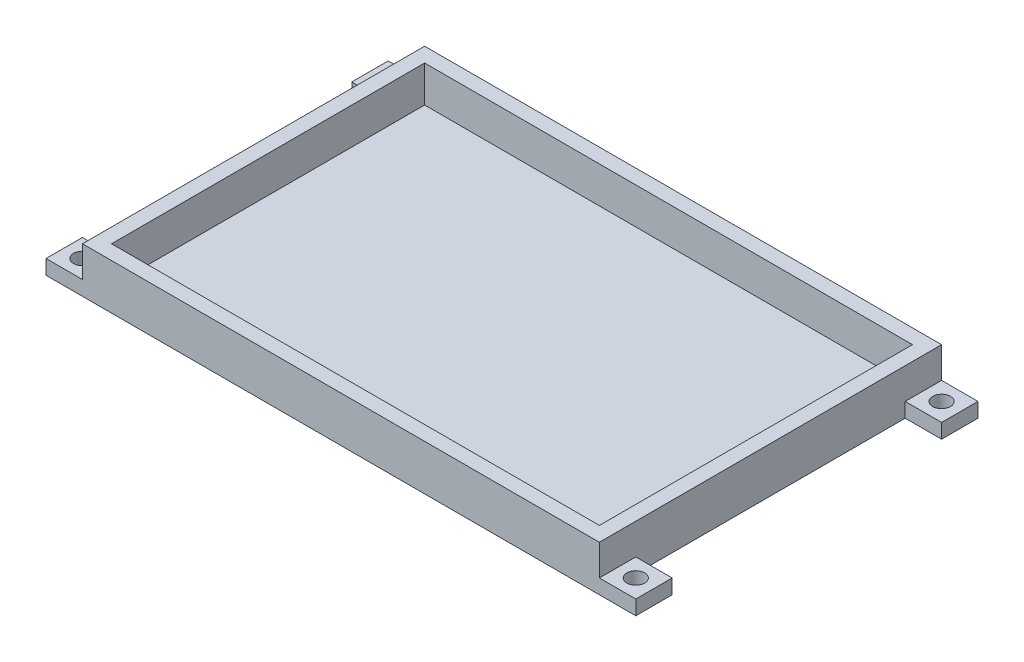
ISO-10303-21;
HEADER;
FILE_DESCRIPTION(('STEP AP214'),'2;1');
FILE_NAME('part.step','',(''),(''),'','','');
FILE_SCHEMA(('AUTOMOTIVE_DESIGN { 1 0 10303 214 1 1 1 1 }'));
ENDSEC;
DATA;
#1=APPLICATION_CONTEXT('core data for automotive mechanical design processes');
#2=APPLICATION_PROTOCOL_DEFINITION('international standard','automotive_design',2000,#1);
#3=PRODUCT_CONTEXT('',#1,'mechanical');
#4=PRODUCT('Part','Part','',(#3));
#5=PRODUCT_RELATED_PRODUCT_CATEGORY('part','',(#4));
#6=PRODUCT_DEFINITION_FORMATION('','',#4);
#7=PRODUCT_DEFINITION_CONTEXT('part definition',#1,'design');
#8=PRODUCT_DEFINITION('design','',#6,#7);
#9=PRODUCT_DEFINITION_SHAPE('','',#8);
#10=(LENGTH_UNIT() NAMED_UNIT(*) SI_UNIT(.MILLI.,.METRE.));
#11=(NAMED_UNIT(*) PLANE_ANGLE_UNIT() SI_UNIT($,.RADIAN.));
#12=(NAMED_UNIT(*) SI_UNIT($,.STERADIAN.) SOLID_ANGLE_UNIT());
#13=UNCERTAINTY_MEASURE_WITH_UNIT(LENGTH_MEASURE(1.E-05),#10,'distance_accuracy_value','');
#14=(GEOMETRIC_REPRESENTATION_CONTEXT(3) GLOBAL_UNCERTAINTY_ASSIGNED_CONTEXT((#13)) GLOBAL_UNIT_ASSIGNED_CONTEXT((#10,
#11,#12)) REPRESENTATION_CONTEXT('',''));
#15=CARTESIAN_POINT('',(0.,0.,0.));
#16=DIRECTION('',(0.,0.,1.));
#17=DIRECTION('',(1.,0.,0.));
#18=AXIS2_PLACEMENT_3D('',#15,#16,#17);
#19=CARTESIAN_POINT('',(87.63,6.35,-57.15));
#20=DIRECTION('',(-1.,0.,0.));
#21=DIRECTION('',(0.,0.,1.));
#22=AXIS2_PLACEMENT_3D('',#19,#20,#21);
#23=PLANE('',#22);
#24=DIRECTION('',(0.,-1.,0.));
#25=VECTOR('',#24,1.);
#26=CARTESIAN_POINT('',(87.63,0.9525,-50.8));
#27=LINE('',#26,#25);
#28=CARTESIAN_POINT('',(87.63,0.9525,-50.8));
#29=VERTEX_POINT('',#28);
#30=CARTESIAN_POINT('',(87.63,-1.5875,-50.8));
#31=VERTEX_POINT('',#30);
#32=EDGE_CURVE('E190',#29,#31,#27,.T.);
#33=ORIENTED_EDGE('',*,*,#32,.F.);
#34=DIRECTION('',(0.,0.,1.));
#35=VECTOR('',#34,1.);
#36=CARTESIAN_POINT('',(87.63,0.9525,0.));
#37=LINE('',#36,#35);
#38=CARTESIAN_POINT('',(87.63,0.9525,-57.15));
#39=VERTEX_POINT('',#38);
#40=EDGE_CURVE('E181',#39,#29,#37,.T.);
#41=ORIENTED_EDGE('',*,*,#40,.F.);
#42=DIRECTION('',(0.,-1.,0.));
#43=VECTOR('',#42,1.);
#44=CARTESIAN_POINT('',(87.63,6.35,-57.15));
#45=LINE('',#44,#43);
#46=CARTESIAN_POINT('',(87.63,6.35,-57.15));
#47=VERTEX_POINT('',#46);
#48=EDGE_CURVE('E355',#47,#39,#45,.T.);
#49=ORIENTED_EDGE('',*,*,#48,.F.);
#50=DIRECTION('',(0.,0.,-1.));
#51=VECTOR('',#50,1.);
#52=CARTESIAN_POINT('',(87.63,6.35,-57.15));
#53=LINE('',#52,#51);
#54=CARTESIAN_POINT('',(87.63,6.35,2.54));
#55=VERTEX_POINT('',#54);
#56=EDGE_CURVE('E348',#55,#47,#53,.T.);
#57=ORIENTED_EDGE('',*,*,#56,.F.);
#58=DIRECTION('',(0.,-1.,0.));
#59=VECTOR('',#58,1.);
#60=CARTESIAN_POINT('',(87.63,6.35,2.54));
#61=LINE('',#60,#59);
#62=CARTESIAN_POINT('',(87.63,0.9525,2.54000000000001));
#63=VERTEX_POINT('',#62);
#64=EDGE_CURVE('E46',#55,#63,#61,.T.);
#65=ORIENTED_EDGE('',*,*,#64,.T.);
#66=DIRECTION('',(0.,0.,1.));
#67=VECTOR('',#66,1.);
#68=CARTESIAN_POINT('',(87.63,0.9525,0.));
#69=LINE('',#68,#67);
#70=CARTESIAN_POINT('',(87.63,0.9525,-3.81000000000001));
#71=VERTEX_POINT('',#70);
#72=EDGE_CURVE('E272',#71,#63,#69,.T.);
#73=ORIENTED_EDGE('',*,*,#72,.F.);
#74=DIRECTION('',(0.,-1.,0.));
#75=VECTOR('',#74,1.);
#76=CARTESIAN_POINT('',(87.63,0.9525,-3.81000000000001));
#77=LINE('',#76,#75);
#78=CARTESIAN_POINT('',(87.63,-1.5875,-3.81000000000001));
#79=VERTEX_POINT('',#78);
#80=EDGE_CURVE('E287',#71,#79,#77,.T.);
#81=ORIENTED_EDGE('',*,*,#80,.T.);
#82=DIRECTION('',(0.,0.,1.));
#83=VECTOR('',#82,1.);
#84=CARTESIAN_POINT('',(87.63,-1.5875,-57.15));
#85=LINE('',#84,#83);
#86=EDGE_CURVE('E298',#31,#79,#85,.T.);
#87=ORIENTED_EDGE('',*,*,#86,.F.);
#88=EDGE_LOOP('',(#33,#41,#49,#57,#65,#73,#81,#87));
#89=FACE_BOUND('',#88,.T.);
#90=ADVANCED_FACE('F38',(#89),#23,.F.);
#91=CARTESIAN_POINT('',(-2.54,6.35,2.54000000000001));
#92=DIRECTION('',(1.,0.,0.));
#93=DIRECTION('',(0.,0.,-1.));
#94=AXIS2_PLACEMENT_3D('',#91,#92,#93);
#95=PLANE('',#94);
#96=DIRECTION('',(0.,0.,-1.));
#97=VECTOR('',#96,1.);
#98=CARTESIAN_POINT('',(-2.54,0.9525,0.));
#99=LINE('',#98,#97);
#100=CARTESIAN_POINT('',(-2.54,0.9525,-50.8));
#101=VERTEX_POINT('',#100);
#102=CARTESIAN_POINT('',(-2.54,0.9525,-57.15));
#103=VERTEX_POINT('',#102);
#104=EDGE_CURVE('E213',#101,#103,#99,.T.);
#105=ORIENTED_EDGE('',*,*,#104,.F.);
#106=DIRECTION('',(0.,-1.,0.));
#107=VECTOR('',#106,1.);
#108=CARTESIAN_POINT('',(-2.54,0.9525,-50.8));
#109=LINE('',#108,#107);
#110=CARTESIAN_POINT('',(-2.54,-1.5875,-50.8));
#111=VERTEX_POINT('',#110);
#112=EDGE_CURVE('E228',#101,#111,#109,.T.);
#113=ORIENTED_EDGE('',*,*,#112,.T.);
#114=DIRECTION('',(0.,0.,-1.));
#115=VECTOR('',#114,1.);
#116=CARTESIAN_POINT('',(-2.54,-1.5875,-57.15));
#117=LINE('',#116,#115);
#118=CARTESIAN_POINT('',(-2.54,-1.5875,-3.81));
#119=VERTEX_POINT('',#118);
#120=EDGE_CURVE('E306',#119,#111,#117,.T.);
#121=ORIENTED_EDGE('',*,*,#120,.F.);
#122=DIRECTION('',(0.,-1.,0.));
#123=VECTOR('',#122,1.);
#124=CARTESIAN_POINT('',(-2.54,0.9525,-3.81));
#125=LINE('',#124,#123);
#126=CARTESIAN_POINT('',(-2.54,0.9525,-3.81));
#127=VERTEX_POINT('',#126);
#128=EDGE_CURVE('E267',#127,#119,#125,.T.);
#129=ORIENTED_EDGE('',*,*,#128,.F.);
#130=DIRECTION('',(0.,0.,-1.));
#131=VECTOR('',#130,1.);
#132=CARTESIAN_POINT('',(-2.54,0.9525,0.));
#133=LINE('',#132,#131);
#134=CARTESIAN_POINT('',(-2.54,0.9525,2.54000000000001));
#135=VERTEX_POINT('',#134);
#136=EDGE_CURVE('E61',#135,#127,#133,.T.);
#137=ORIENTED_EDGE('',*,*,#136,.F.);
#138=DIRECTION('',(0.,-1.,0.));
#139=VECTOR('',#138,1.);
#140=CARTESIAN_POINT('',(-2.54,6.35,2.54000000000001));
#141=LINE('',#140,#139);
#142=CARTESIAN_POINT('',(-2.54,6.35,2.54000000000001));
#143=VERTEX_POINT('',#142);
#144=EDGE_CURVE('E11',#143,#135,#141,.T.);
#145=ORIENTED_EDGE('',*,*,#144,.F.);
#146=DIRECTION('',(0.,0.,1.));
#147=VECTOR('',#146,1.);
#148=CARTESIAN_POINT('',(-2.54,6.35,2.54000000000001));
#149=LINE('',#148,#147);
#150=CARTESIAN_POINT('',(-2.54,6.35,-57.15));
#151=VERTEX_POINT('',#150);
#152=EDGE_CURVE('E343',#151,#143,#149,.T.);
#153=ORIENTED_EDGE('',*,*,#152,.F.);
#154=DIRECTION('',(0.,-1.,0.));
#155=VECTOR('',#154,1.);
#156=CARTESIAN_POINT('',(-2.54,6.35,-57.15));
#157=LINE('',#156,#155);
#158=EDGE_CURVE('E352',#151,#103,#157,.T.);
#159=ORIENTED_EDGE('',*,*,#158,.T.);
#160=EDGE_LOOP('',(#105,#113,#121,#129,#137,#145,#153,#159));
#161=FACE_BOUND('',#160,.T.);
#162=ADVANCED_FACE('F40',(#161),#95,.F.);
#163=CARTESIAN_POINT('',(0.,6.35,0.));
#164=DIRECTION('',(0.,-1.,0.));
#165=DIRECTION('',(0.,0.,-1.));
#166=AXIS2_PLACEMENT_3D('',#163,#164,#165);
#167=PLANE('',#166);
#168=ORIENTED_EDGE('',*,*,#152,.T.);
#169=DIRECTION('',(1.,0.,0.));
#170=VECTOR('',#169,1.);
#171=CARTESIAN_POINT('',(87.63,6.35,2.54));
#172=LINE('',#171,#170);
#173=EDGE_CURVE('E346',#143,#55,#172,.T.);
#174=ORIENTED_EDGE('',*,*,#173,.T.);
#175=ORIENTED_EDGE('',*,*,#56,.T.);
#176=DIRECTION('',(-1.,0.,0.));
#177=VECTOR('',#176,1.);
#178=CARTESIAN_POINT('',(-2.54,6.35,-57.15));
#179=LINE('',#178,#177);
#180=EDGE_CURVE('E350',#47,#151,#179,.T.);
#181=ORIENTED_EDGE('',*,*,#180,.T.);
#182=EDGE_LOOP('',(#168,#174,#175,#181));
#183=FACE_BOUND('',#182,.T.);
#184=DIRECTION('',(0.,0.,1.));
#185=VECTOR('',#184,1.);
#186=CARTESIAN_POINT('',(0.,6.35,0.));
#187=LINE('',#186,#185);
#188=CARTESIAN_POINT('',(0.,6.35,-54.61));
#189=VERTEX_POINT('',#188);
#190=CARTESIAN_POINT('',(0.,6.35,0.));
#191=VERTEX_POINT('',#190);
#192=EDGE_CURVE('E312',#189,#191,#187,.T.);
#193=ORIENTED_EDGE('',*,*,#192,.F.);
#194=DIRECTION('',(-1.,0.,0.));
#195=VECTOR('',#194,1.);
#196=CARTESIAN_POINT('',(0.,6.35,-54.61));
#197=LINE('',#196,#195);
#198=CARTESIAN_POINT('',(85.09,6.35,-54.61));
#199=VERTEX_POINT('',#198);
#200=EDGE_CURVE('E320',#199,#189,#197,.T.);
#201=ORIENTED_EDGE('',*,*,#200,.F.);
#202=DIRECTION('',(0.,0.,-1.));
#203=VECTOR('',#202,1.);
#204=CARTESIAN_POINT('',(85.09,6.35,0.));
#205=LINE('',#204,#203);
#206=CARTESIAN_POINT('',(85.09,6.35,0.));
#207=VERTEX_POINT('',#206);
#208=EDGE_CURVE('E317',#207,#199,#205,.T.);
#209=ORIENTED_EDGE('',*,*,#208,.F.);
#210=DIRECTION('',(1.,0.,0.));
#211=VECTOR('',#210,1.);
#212=CARTESIAN_POINT('',(0.,6.35,0.));
#213=LINE('',#212,#211);
#214=EDGE_CURVE('E314',#191,#207,#213,.T.);
#215=ORIENTED_EDGE('',*,*,#214,.F.);
#216=EDGE_LOOP('',(#193,#201,#209,#215));
#217=FACE_BOUND('',#216,.T.);
#218=ADVANCED_FACE('F398',(#183,#217),#167,.F.);
#219=CARTESIAN_POINT('',(87.63,6.35,2.54));
#220=DIRECTION('',(0.,0.,-1.));
#221=DIRECTION('',(-1.,0.,0.));
#222=AXIS2_PLACEMENT_3D('',#219,#220,#221);
#223=PLANE('',#222);
#224=ORIENTED_EDGE('',*,*,#144,.T.);
#225=DIRECTION('',(-1.,0.,0.));
#226=VECTOR('',#225,1.);
#227=CARTESIAN_POINT('',(0.,0.9525,2.54000000000001));
#228=LINE('',#227,#226);
#229=CARTESIAN_POINT('',(-8.88999999999999,0.9525,2.54000000000001));
#230=VERTEX_POINT('',#229);
#231=EDGE_CURVE('E253',#135,#230,#228,.T.);
#232=ORIENTED_EDGE('',*,*,#231,.T.);
#233=DIRECTION('',(0.,-1.,0.));
#234=VECTOR('',#233,1.);
#235=CARTESIAN_POINT('',(-8.88999999999999,0.9525,2.54000000000001));
#236=LINE('',#235,#234);
#237=CARTESIAN_POINT('',(-8.88999999999999,-1.5875,2.54000000000001));
#238=VERTEX_POINT('',#237);
#239=EDGE_CURVE('E263',#230,#238,#236,.T.);
#240=ORIENTED_EDGE('',*,*,#239,.T.);
#241=DIRECTION('',(-1.,0.,0.));
#242=VECTOR('',#241,1.);
#243=CARTESIAN_POINT('',(87.63,-1.5875,2.54000000000001));
#244=LINE('',#243,#242);
#245=CARTESIAN_POINT('',(93.98,-1.5875,2.54));
#246=VERTEX_POINT('',#245);
#247=EDGE_CURVE('E304',#246,#238,#244,.T.);
#248=ORIENTED_EDGE('',*,*,#247,.F.);
#249=DIRECTION('',(0.,-1.,0.));
#250=VECTOR('',#249,1.);
#251=CARTESIAN_POINT('',(93.98,0.9525,2.54));
#252=LINE('',#251,#250);
#253=CARTESIAN_POINT('',(93.98,0.9525,2.54));
#254=VERTEX_POINT('',#253);
#255=EDGE_CURVE('E295',#254,#246,#252,.T.);
#256=ORIENTED_EDGE('',*,*,#255,.F.);
#257=DIRECTION('',(1.,0.,0.));
#258=VECTOR('',#257,1.);
#259=CARTESIAN_POINT('',(0.,0.9525,2.54));
#260=LINE('',#259,#258);
#261=EDGE_CURVE('E282',#63,#254,#260,.T.);
#262=ORIENTED_EDGE('',*,*,#261,.F.);
#263=ORIENTED_EDGE('',*,*,#64,.F.);
#264=ORIENTED_EDGE('',*,*,#173,.F.);
#265=EDGE_LOOP('',(#224,#232,#240,#248,#256,#262,#263,#264));
#266=FACE_BOUND('',#265,.T.);
#267=ADVANCED_FACE('F364',(#266),#223,.F.);
#268=CARTESIAN_POINT('',(-2.54,6.35,-57.15));
#269=DIRECTION('',(0.,0.,1.));
#270=DIRECTION('',(1.,0.,0.));
#271=AXIS2_PLACEMENT_3D('',#268,#269,#270);
#272=PLANE('',#271);
#273=ORIENTED_EDGE('',*,*,#48,.T.);
#274=DIRECTION('',(1.,0.,0.));
#275=VECTOR('',#274,1.);
#276=CARTESIAN_POINT('',(0.,0.9525,-57.15));
#277=LINE('',#276,#275);
#278=CARTESIAN_POINT('',(93.98,0.9525,-57.15));
#279=VERTEX_POINT('',#278);
#280=EDGE_CURVE('E191',#39,#279,#277,.T.);
#281=ORIENTED_EDGE('',*,*,#280,.T.);
#282=DIRECTION('',(0.,-1.,0.));
#283=VECTOR('',#282,1.);
#284=CARTESIAN_POINT('',(93.98,0.9525,-57.15));
#285=LINE('',#284,#283);
#286=CARTESIAN_POINT('',(93.98,-1.5875,-57.15));
#287=VERTEX_POINT('',#286);
#288=EDGE_CURVE('E195',#279,#287,#285,.T.);
#289=ORIENTED_EDGE('',*,*,#288,.T.);
#290=DIRECTION('',(1.,0.,0.));
#291=VECTOR('',#290,1.);
#292=CARTESIAN_POINT('',(87.63,-1.5875,-57.15));
#293=LINE('',#292,#291);
#294=CARTESIAN_POINT('',(-8.89,-1.5875,-57.15));
#295=VERTEX_POINT('',#294);
#296=EDGE_CURVE('E309',#295,#287,#293,.T.);
#297=ORIENTED_EDGE('',*,*,#296,.F.);
#298=DIRECTION('',(0.,-1.,0.));
#299=VECTOR('',#298,1.);
#300=CARTESIAN_POINT('',(-8.89,0.9525,-57.15));
#301=LINE('',#300,#299);
#302=CARTESIAN_POINT('',(-8.89,0.9525,-57.15));
#303=VERTEX_POINT('',#302);
#304=EDGE_CURVE('E236',#303,#295,#301,.T.);
#305=ORIENTED_EDGE('',*,*,#304,.F.);
#306=DIRECTION('',(-1.,0.,0.));
#307=VECTOR('',#306,1.);
#308=CARTESIAN_POINT('',(0.,0.9525,-57.15));
#309=LINE('',#308,#307);
#310=EDGE_CURVE('E223',#103,#303,#309,.T.);
#311=ORIENTED_EDGE('',*,*,#310,.F.);
#312=ORIENTED_EDGE('',*,*,#158,.F.);
#313=ORIENTED_EDGE('',*,*,#180,.F.);
#314=EDGE_LOOP('',(#273,#281,#289,#297,#305,#311,#312,#313));
#315=FACE_BOUND('',#314,.T.);
#316=ADVANCED_FACE('F400',(#315),#272,.F.);
#317=CARTESIAN_POINT('',(0.,6.35,0.));
#318=DIRECTION('',(1.,0.,0.));
#319=DIRECTION('',(0.,0.,-1.));
#320=AXIS2_PLACEMENT_3D('',#317,#318,#319);
#321=PLANE('',#320);
#322=DIRECTION('',(0.,0.,1.));
#323=VECTOR('',#322,1.);
#324=CARTESIAN_POINT('',(0.,0.,0.));
#325=LINE('',#324,#323);
#326=CARTESIAN_POINT('',(0.,0.,-54.61));
#327=VERTEX_POINT('',#326);
#328=CARTESIAN_POINT('',(0.,0.,0.));
#329=VERTEX_POINT('',#328);
#330=EDGE_CURVE('E311',#327,#329,#325,.T.);
#331=ORIENTED_EDGE('',*,*,#330,.F.);
#332=DIRECTION('',(0.,-1.,0.));
#333=VECTOR('',#332,1.);
#334=CARTESIAN_POINT('',(0.,6.35,-54.61));
#335=LINE('',#334,#333);
#336=EDGE_CURVE('E322',#189,#327,#335,.T.);
#337=ORIENTED_EDGE('',*,*,#336,.F.);
#338=ORIENTED_EDGE('',*,*,#192,.T.);
#339=DIRECTION('',(0.,-1.,0.));
#340=VECTOR('',#339,1.);
#341=CARTESIAN_POINT('',(0.,6.35,0.));
#342=LINE('',#341,#340);
#343=EDGE_CURVE('E340',#191,#329,#342,.T.);
#344=ORIENTED_EDGE('',*,*,#343,.T.);
#345=EDGE_LOOP('',(#331,#337,#338,#344));
#346=FACE_BOUND('',#345,.T.);
#347=ADVANCED_FACE('F406',(#346),#321,.T.);
#348=CARTESIAN_POINT('',(0.,6.35,0.));
#349=DIRECTION('',(0.,0.,-1.));
#350=DIRECTION('',(-1.,0.,0.));
#351=AXIS2_PLACEMENT_3D('',#348,#349,#350);
#352=PLANE('',#351);
#353=DIRECTION('',(1.,0.,0.));
#354=VECTOR('',#353,1.);
#355=CARTESIAN_POINT('',(0.,0.,0.));
#356=LINE('',#355,#354);
#357=CARTESIAN_POINT('',(85.09,0.,0.));
#358=VERTEX_POINT('',#357);
#359=EDGE_CURVE('E325',#329,#358,#356,.T.);
#360=ORIENTED_EDGE('',*,*,#359,.F.);
#361=ORIENTED_EDGE('',*,*,#343,.F.);
#362=ORIENTED_EDGE('',*,*,#214,.T.);
#363=DIRECTION('',(0.,-1.,0.));
#364=VECTOR('',#363,1.);
#365=CARTESIAN_POINT('',(85.09,6.35,0.));
#366=LINE('',#365,#364);
#367=EDGE_CURVE('E338',#207,#358,#366,.T.);
#368=ORIENTED_EDGE('',*,*,#367,.T.);
#369=EDGE_LOOP('',(#360,#361,#362,#368));
#370=FACE_BOUND('',#369,.T.);
#371=ADVANCED_FACE('F416',(#370),#352,.T.);
#372=CARTESIAN_POINT('',(85.09,6.35,0.));
#373=DIRECTION('',(-1.,0.,0.));
#374=DIRECTION('',(0.,0.,1.));
#375=AXIS2_PLACEMENT_3D('',#372,#373,#374);
#376=PLANE('',#375);
#377=DIRECTION('',(0.,0.,-1.));
#378=VECTOR('',#377,1.);
#379=CARTESIAN_POINT('',(85.09,0.,0.));
#380=LINE('',#379,#378);
#381=CARTESIAN_POINT('',(85.09,0.,-54.61));
#382=VERTEX_POINT('',#381);
#383=EDGE_CURVE('E328',#358,#382,#380,.T.);
#384=ORIENTED_EDGE('',*,*,#383,.F.);
#385=ORIENTED_EDGE('',*,*,#367,.F.);
#386=ORIENTED_EDGE('',*,*,#208,.T.);
#387=DIRECTION('',(0.,-1.,0.));
#388=VECTOR('',#387,1.);
#389=CARTESIAN_POINT('',(85.09,6.35,-54.61));
#390=LINE('',#389,#388);
#391=EDGE_CURVE('E335',#199,#382,#390,.T.);
#392=ORIENTED_EDGE('',*,*,#391,.T.);
#393=EDGE_LOOP('',(#384,#385,#386,#392));
#394=FACE_BOUND('',#393,.T.);
#395=ADVANCED_FACE('F420',(#394),#376,.T.);
#396=CARTESIAN_POINT('',(0.,6.35,-54.61));
#397=DIRECTION('',(0.,0.,1.));
#398=DIRECTION('',(1.,0.,0.));
#399=AXIS2_PLACEMENT_3D('',#396,#397,#398);
#400=PLANE('',#399);
#401=DIRECTION('',(-1.,0.,0.));
#402=VECTOR('',#401,1.);
#403=CARTESIAN_POINT('',(0.,0.,-54.61));
#404=LINE('',#403,#402);
#405=EDGE_CURVE('E315',#382,#327,#404,.T.);
#406=ORIENTED_EDGE('',*,*,#405,.F.);
#407=ORIENTED_EDGE('',*,*,#391,.F.);
#408=ORIENTED_EDGE('',*,*,#200,.T.);
#409=ORIENTED_EDGE('',*,*,#336,.T.);
#410=EDGE_LOOP('',(#406,#407,#408,#409));
#411=FACE_BOUND('',#410,.T.);
#412=ADVANCED_FACE('F424',(#411),#400,.T.);
#413=CARTESIAN_POINT('',(0.,0.,0.));
#414=DIRECTION('',(0.,-1.,0.));
#415=DIRECTION('',(0.,0.,-1.));
#416=AXIS2_PLACEMENT_3D('',#413,#414,#415);
#417=PLANE('',#416);
#418=ORIENTED_EDGE('',*,*,#383,.T.);
#419=ORIENTED_EDGE('',*,*,#405,.T.);
#420=ORIENTED_EDGE('',*,*,#330,.T.);
#421=ORIENTED_EDGE('',*,*,#359,.T.);
#422=EDGE_LOOP('',(#418,#419,#420,#421));
#423=FACE_BOUND('',#422,.T.);
#424=ADVANCED_FACE('F389',(#423),#417,.F.);
#425=CARTESIAN_POINT('',(0.,-1.5875,0.));
#426=DIRECTION('',(0.,-1.,0.));
#427=DIRECTION('',(0.,0.,-1.));
#428=AXIS2_PLACEMENT_3D('',#425,#426,#427);
#429=PLANE('',#428);
#430=ORIENTED_EDGE('',*,*,#296,.T.);
#431=DIRECTION('',(0.,0.,-1.));
#432=VECTOR('',#431,1.);
#433=CARTESIAN_POINT('',(93.98,-1.5875,0.));
#434=LINE('',#433,#432);
#435=CARTESIAN_POINT('',(93.98,-1.5875,-50.8));
#436=VERTEX_POINT('',#435);
#437=EDGE_CURVE('E207',#436,#287,#434,.T.);
#438=ORIENTED_EDGE('',*,*,#437,.F.);
#439=DIRECTION('',(1.,0.,0.));
#440=VECTOR('',#439,1.);
#441=CARTESIAN_POINT('',(0.,-1.5875,-50.7999999999999));
#442=LINE('',#441,#440);
#443=EDGE_CURVE('E53',#31,#436,#442,.T.);
#444=ORIENTED_EDGE('',*,*,#443,.F.);
#445=ORIENTED_EDGE('',*,*,#86,.T.);
#446=DIRECTION('',(1.,0.,0.));
#447=VECTOR('',#446,1.);
#448=CARTESIAN_POINT('',(0.,-1.5875,-3.8100000000001));
#449=LINE('',#448,#447);
#450=CARTESIAN_POINT('',(93.98,-1.5875,-3.81));
#451=VERTEX_POINT('',#450);
#452=EDGE_CURVE('E266',#79,#451,#449,.T.);
#453=ORIENTED_EDGE('',*,*,#452,.T.);
#454=DIRECTION('',(0.,0.,1.));
#455=VECTOR('',#454,1.);
#456=CARTESIAN_POINT('',(93.98,-1.5875,0.));
#457=LINE('',#456,#455);
#458=EDGE_CURVE('E290',#451,#246,#457,.T.);
#459=ORIENTED_EDGE('',*,*,#458,.T.);
#460=ORIENTED_EDGE('',*,*,#247,.T.);
#461=DIRECTION('',(0.,0.,1.));
#462=VECTOR('',#461,1.);
#463=CARTESIAN_POINT('',(-8.88999999999999,-1.5875,0.));
#464=LINE('',#463,#462);
#465=CARTESIAN_POINT('',(-8.88999999999999,-1.5875,-3.80999999999999));
#466=VERTEX_POINT('',#465);
#467=EDGE_CURVE('E259',#466,#238,#464,.T.);
#468=ORIENTED_EDGE('',*,*,#467,.F.);
#469=DIRECTION('',(-1.,0.,0.));
#470=VECTOR('',#469,1.);
#471=CARTESIAN_POINT('',(0.,-1.5875,-3.81));
#472=LINE('',#471,#470);
#473=EDGE_CURVE('E248',#119,#466,#472,.T.);
#474=ORIENTED_EDGE('',*,*,#473,.F.);
#475=ORIENTED_EDGE('',*,*,#120,.T.);
#476=DIRECTION('',(-1.,0.,0.));
#477=VECTOR('',#476,1.);
#478=CARTESIAN_POINT('',(0.,-1.5875,-50.8));
#479=LINE('',#478,#477);
#480=CARTESIAN_POINT('',(-8.89,-1.5875,-50.8));
#481=VERTEX_POINT('',#480);
#482=EDGE_CURVE('E211',#111,#481,#479,.T.);
#483=ORIENTED_EDGE('',*,*,#482,.T.);
#484=DIRECTION('',(0.,0.,-1.));
#485=VECTOR('',#484,1.);
#486=CARTESIAN_POINT('',(-8.89,-1.5875,0.));
#487=LINE('',#486,#485);
#488=EDGE_CURVE('E231',#481,#295,#487,.T.);
#489=ORIENTED_EDGE('',*,*,#488,.T.);
#490=EDGE_LOOP('',(#430,#438,#444,#445,#453,#459,#460,#468,#474,#475,#483,#489));
#491=FACE_BOUND('',#490,.T.);
#492=CARTESIAN_POINT('',(90.805,-1.5875,-0.635000000000004));
#493=DIRECTION('',(0.,-1.,0.));
#494=DIRECTION('',(0.,0.,-1.));
#495=AXIS2_PLACEMENT_3D('',#492,#493,#494);
#496=CIRCLE('',#495,1.54999999999999);
#497=CARTESIAN_POINT('',(90.805,-1.5875,-2.185));
#498=VERTEX_POINT('',#497);
#499=EDGE_CURVE('E276',#498,#498,#496,.F.);
#500=ORIENTED_EDGE('',*,*,#499,.T.);
#501=EDGE_LOOP('',(#500));
#502=FACE_BOUND('',#501,.T.);
#503=CARTESIAN_POINT('',(-5.71499999999998,-1.5875,-0.634999999999997));
#504=DIRECTION('',(0.,-1.,0.));
#505=DIRECTION('',(0.,0.,-1.));
#506=AXIS2_PLACEMENT_3D('',#503,#504,#505);
#507=CIRCLE('',#506,1.54999999999999);
#508=CARTESIAN_POINT('',(-5.71499999999998,-1.5875,-2.18499999999999));
#509=VERTEX_POINT('',#508);
#510=EDGE_CURVE('E239',#509,#509,#507,.T.);
#511=ORIENTED_EDGE('',*,*,#510,.F.);
#512=EDGE_LOOP('',(#511));
#513=FACE_BOUND('',#512,.T.);
#514=CARTESIAN_POINT('',(-5.71499999999998,-1.5875,-53.975));
#515=DIRECTION('',(0.,-1.,0.));
#516=DIRECTION('',(0.,0.,-1.));
#517=AXIS2_PLACEMENT_3D('',#514,#515,#516);
#518=CIRCLE('',#517,1.54999999999999);
#519=CARTESIAN_POINT('',(-5.71499999999998,-1.5875,-55.525));
#520=VERTEX_POINT('',#519);
#521=EDGE_CURVE('E217',#520,#520,#518,.F.);
#522=ORIENTED_EDGE('',*,*,#521,.T.);
#523=EDGE_LOOP('',(#522));
#524=FACE_BOUND('',#523,.T.);
#525=CARTESIAN_POINT('',(90.805,-1.5875,-53.975));
#526=DIRECTION('',(0.,-1.,0.));
#527=DIRECTION('',(0.,0.,-1.));
#528=AXIS2_PLACEMENT_3D('',#525,#526,#527);
#529=CIRCLE('',#528,1.54999999999999);
#530=CARTESIAN_POINT('',(90.805,-1.5875,-55.525));
#531=VERTEX_POINT('',#530);
#532=EDGE_CURVE('E204',#531,#531,#529,.T.);
#533=ORIENTED_EDGE('',*,*,#532,.F.);
#534=EDGE_LOOP('',(#533));
#535=FACE_BOUND('',#534,.T.);
#536=ADVANCED_FACE('F376',(#491,#502,#513,#524,#535),#429,.T.);
#537=CARTESIAN_POINT('',(93.98,0.9525,0.));
#538=DIRECTION('',(1.,0.,0.));
#539=DIRECTION('',(0.,0.,-1.));
#540=AXIS2_PLACEMENT_3D('',#537,#538,#539);
#541=PLANE('',#540);
#542=ORIENTED_EDGE('',*,*,#458,.F.);
#543=DIRECTION('',(0.,-1.,0.));
#544=VECTOR('',#543,1.);
#545=CARTESIAN_POINT('',(93.98,0.9525,-3.81));
#546=LINE('',#545,#544);
#547=CARTESIAN_POINT('',(93.98,0.9525,-3.81));
#548=VERTEX_POINT('',#547);
#549=EDGE_CURVE('E299',#548,#451,#546,.T.);
#550=ORIENTED_EDGE('',*,*,#549,.F.);
#551=DIRECTION('',(0.,0.,1.));
#552=VECTOR('',#551,1.);
#553=CARTESIAN_POINT('',(93.98,0.9525,0.));
#554=LINE('',#553,#552);
#555=EDGE_CURVE('E279',#548,#254,#554,.T.);
#556=ORIENTED_EDGE('',*,*,#555,.T.);
#557=ORIENTED_EDGE('',*,*,#255,.T.);
#558=EDGE_LOOP('',(#542,#550,#556,#557));
#559=FACE_BOUND('',#558,.T.);
#560=ADVANCED_FACE('F380',(#559),#541,.T.);
#561=CARTESIAN_POINT('',(0.,0.9525,-3.8100000000001));
#562=DIRECTION('',(0.,0.,-1.));
#563=DIRECTION('',(-1.,0.,0.));
#564=AXIS2_PLACEMENT_3D('',#561,#562,#563);
#565=PLANE('',#564);
#566=ORIENTED_EDGE('',*,*,#452,.F.);
#567=ORIENTED_EDGE('',*,*,#80,.F.);
#568=DIRECTION('',(1.,0.,0.));
#569=VECTOR('',#568,1.);
#570=CARTESIAN_POINT('',(0.,0.9525,-3.8100000000001));
#571=LINE('',#570,#569);
#572=EDGE_CURVE('E275',#71,#548,#571,.T.);
#573=ORIENTED_EDGE('',*,*,#572,.T.);
#574=ORIENTED_EDGE('',*,*,#549,.T.);
#575=EDGE_LOOP('',(#566,#567,#573,#574));
#576=FACE_BOUND('',#575,.T.);
#577=ADVANCED_FACE('F373',(#576),#565,.T.);
#578=CARTESIAN_POINT('',(90.805,0.9525,-0.635000000000004));
#579=DIRECTION('',(0.,-1.,0.));
#580=DIRECTION('',(0.,0.,-1.));
#581=AXIS2_PLACEMENT_3D('',#578,#579,#580);
#582=CYLINDRICAL_SURFACE('',#581,1.54999999999999);
#583=CARTESIAN_POINT('',(90.805,0.9525,-0.635000000000004));
#584=DIRECTION('',(0.,-1.,0.));
#585=DIRECTION('',(0.,0.,-1.));
#586=AXIS2_PLACEMENT_3D('',#583,#584,#585);
#587=CIRCLE('',#586,1.54999999999999);
#588=CARTESIAN_POINT('',(90.805,0.9525,-2.185));
#589=VERTEX_POINT('',#588);
#590=EDGE_CURVE('E284',#589,#589,#587,.F.);
#591=ORIENTED_EDGE('',*,*,#590,.T.);
#592=EDGE_LOOP('',(#591));
#593=FACE_BOUND('',#592,.T.);
#594=ORIENTED_EDGE('',*,*,#499,.F.);
#595=EDGE_LOOP('',(#594));
#596=FACE_BOUND('',#595,.T.);
#597=ADVANCED_FACE('F387',(#593,#596),#582,.F.);
#598=CARTESIAN_POINT('',(0.,0.9525,0.));
#599=DIRECTION('',(0.,-1.,0.));
#600=DIRECTION('',(0.,0.,-1.));
#601=AXIS2_PLACEMENT_3D('',#598,#599,#600);
#602=PLANE('',#601);
#603=ORIENTED_EDGE('',*,*,#72,.T.);
#604=ORIENTED_EDGE('',*,*,#261,.T.);
#605=ORIENTED_EDGE('',*,*,#555,.F.);
#606=ORIENTED_EDGE('',*,*,#572,.F.);
#607=EDGE_LOOP('',(#603,#604,#605,#606));
#608=FACE_BOUND('',#607,.T.);
#609=ORIENTED_EDGE('',*,*,#590,.F.);
#610=EDGE_LOOP('',(#609));
#611=FACE_BOUND('',#610,.T.);
#612=ADVANCED_FACE('F369',(#608,#611),#602,.F.);
#613=CARTESIAN_POINT('',(-8.88999999999999,0.9525,0.));
#614=DIRECTION('',(1.,0.,0.));
#615=DIRECTION('',(0.,0.,-1.));
#616=AXIS2_PLACEMENT_3D('',#613,#614,#615);
#617=PLANE('',#616);
#618=ORIENTED_EDGE('',*,*,#467,.T.);
#619=ORIENTED_EDGE('',*,*,#239,.F.);
#620=DIRECTION('',(0.,0.,1.));
#621=VECTOR('',#620,1.);
#622=CARTESIAN_POINT('',(-8.88999999999999,0.9525,0.));
#623=LINE('',#622,#621);
#624=CARTESIAN_POINT('',(-8.88999999999999,0.9525,-3.80999999999999));
#625=VERTEX_POINT('',#624);
#626=EDGE_CURVE('E247',#625,#230,#623,.T.);
#627=ORIENTED_EDGE('',*,*,#626,.F.);
#628=DIRECTION('',(0.,-1.,0.));
#629=VECTOR('',#628,1.);
#630=CARTESIAN_POINT('',(-8.88999999999999,0.9525,-3.80999999999999));
#631=LINE('',#630,#629);
#632=EDGE_CURVE('E256',#625,#466,#631,.T.);
#633=ORIENTED_EDGE('',*,*,#632,.T.);
#634=EDGE_LOOP('',(#618,#619,#627,#633));
#635=FACE_BOUND('',#634,.T.);
#636=ADVANCED_FACE('F542',(#635),#617,.F.);
#637=CARTESIAN_POINT('',(-5.71499999999998,0.9525,-0.634999999999997));
#638=DIRECTION('',(0.,-1.,0.));
#639=DIRECTION('',(0.,0.,-1.));
#640=AXIS2_PLACEMENT_3D('',#637,#638,#639);
#641=CYLINDRICAL_SURFACE('',#640,1.54999999999999);
#642=CARTESIAN_POINT('',(-5.71499999999998,0.9525,-0.634999999999997));
#643=DIRECTION('',(0.,-1.,0.));
#644=DIRECTION('',(0.,0.,-1.));
#645=AXIS2_PLACEMENT_3D('',#642,#643,#644);
#646=CIRCLE('',#645,1.54999999999999);
#647=CARTESIAN_POINT('',(-5.71499999999998,0.9525,-2.18499999999999));
#648=VERTEX_POINT('',#647);
#649=EDGE_CURVE('E244',#648,#648,#646,.T.);
#650=ORIENTED_EDGE('',*,*,#649,.F.);
#651=EDGE_LOOP('',(#650));
#652=FACE_BOUND('',#651,.T.);
#653=ORIENTED_EDGE('',*,*,#510,.T.);
#654=EDGE_LOOP('',(#653));
#655=FACE_BOUND('',#654,.T.);
#656=ADVANCED_FACE('F549',(#652,#655),#641,.F.);
#657=CARTESIAN_POINT('',(0.,0.9525,-3.81));
#658=DIRECTION('',(0.,0.,1.));
#659=DIRECTION('',(1.,0.,0.));
#660=AXIS2_PLACEMENT_3D('',#657,#658,#659);
#661=PLANE('',#660);
#662=ORIENTED_EDGE('',*,*,#473,.T.);
#663=ORIENTED_EDGE('',*,*,#632,.F.);
#664=DIRECTION('',(-1.,0.,0.));
#665=VECTOR('',#664,1.);
#666=CARTESIAN_POINT('',(0.,0.9525,-3.81));
#667=LINE('',#666,#665);
#668=EDGE_CURVE('E250',#127,#625,#667,.T.);
#669=ORIENTED_EDGE('',*,*,#668,.F.);
#670=ORIENTED_EDGE('',*,*,#128,.T.);
#671=EDGE_LOOP('',(#662,#663,#669,#670));
#672=FACE_BOUND('',#671,.T.);
#673=ADVANCED_FACE('F560',(#672),#661,.F.);
#674=CARTESIAN_POINT('',(0.,0.9525,0.));
#675=DIRECTION('',(0.,-1.,0.));
#676=DIRECTION('',(0.,0.,-1.));
#677=AXIS2_PLACEMENT_3D('',#674,#675,#676);
#678=PLANE('',#677);
#679=ORIENTED_EDGE('',*,*,#649,.T.);
#680=EDGE_LOOP('',(#679));
#681=FACE_BOUND('',#680,.T.);
#682=ORIENTED_EDGE('',*,*,#626,.T.);
#683=ORIENTED_EDGE('',*,*,#231,.F.);
#684=ORIENTED_EDGE('',*,*,#136,.T.);
#685=ORIENTED_EDGE('',*,*,#668,.T.);
#686=EDGE_LOOP('',(#682,#683,#684,#685));
#687=FACE_BOUND('',#686,.T.);
#688=ADVANCED_FACE('F571',(#681,#687),#678,.F.);
#689=CARTESIAN_POINT('',(-8.89,0.9525,0.));
#690=DIRECTION('',(-1.,0.,0.));
#691=DIRECTION('',(0.,0.,1.));
#692=AXIS2_PLACEMENT_3D('',#689,#690,#691);
#693=PLANE('',#692);
#694=ORIENTED_EDGE('',*,*,#488,.F.);
#695=DIRECTION('',(0.,-1.,0.));
#696=VECTOR('',#695,1.);
#697=CARTESIAN_POINT('',(-8.89,0.9525,-50.8));
#698=LINE('',#697,#696);
#699=CARTESIAN_POINT('',(-8.89,0.9525,-50.8));
#700=VERTEX_POINT('',#699);
#701=EDGE_CURVE('E240',#700,#481,#698,.T.);
#702=ORIENTED_EDGE('',*,*,#701,.F.);
#703=DIRECTION('',(0.,0.,-1.));
#704=VECTOR('',#703,1.);
#705=CARTESIAN_POINT('',(-8.89,0.9525,0.));
#706=LINE('',#705,#704);
#707=EDGE_CURVE('E220',#700,#303,#706,.T.);
#708=ORIENTED_EDGE('',*,*,#707,.T.);
#709=ORIENTED_EDGE('',*,*,#304,.T.);
#710=EDGE_LOOP('',(#694,#702,#708,#709));
#711=FACE_BOUND('',#710,.T.);
#712=ADVANCED_FACE('F582',(#711),#693,.T.);
#713=CARTESIAN_POINT('',(0.,0.9525,-50.8));
#714=DIRECTION('',(0.,0.,1.));
#715=DIRECTION('',(1.,0.,0.));
#716=AXIS2_PLACEMENT_3D('',#713,#714,#715);
#717=PLANE('',#716);
#718=ORIENTED_EDGE('',*,*,#482,.F.);
#719=ORIENTED_EDGE('',*,*,#112,.F.);
#720=DIRECTION('',(-1.,0.,0.));
#721=VECTOR('',#720,1.);
#722=CARTESIAN_POINT('',(0.,0.9525,-50.8));
#723=LINE('',#722,#721);
#724=EDGE_CURVE('E216',#101,#700,#723,.T.);
#725=ORIENTED_EDGE('',*,*,#724,.T.);
#726=ORIENTED_EDGE('',*,*,#701,.T.);
#727=EDGE_LOOP('',(#718,#719,#725,#726));
#728=FACE_BOUND('',#727,.T.);
#729=ADVANCED_FACE('F590',(#728),#717,.T.);
#730=CARTESIAN_POINT('',(-5.71499999999998,0.9525,-53.975));
#731=DIRECTION('',(0.,-1.,0.));
#732=DIRECTION('',(0.,0.,-1.));
#733=AXIS2_PLACEMENT_3D('',#730,#731,#732);
#734=CYLINDRICAL_SURFACE('',#733,1.54999999999999);
#735=CARTESIAN_POINT('',(-5.71499999999998,0.9525,-53.975));
#736=DIRECTION('',(0.,-1.,0.));
#737=DIRECTION('',(0.,0.,-1.));
#738=AXIS2_PLACEMENT_3D('',#735,#736,#737);
#739=CIRCLE('',#738,1.54999999999999);
#740=CARTESIAN_POINT('',(-5.71499999999998,0.9525,-55.525));
#741=VERTEX_POINT('',#740);
#742=EDGE_CURVE('E225',#741,#741,#739,.F.);
#743=ORIENTED_EDGE('',*,*,#742,.T.);
#744=EDGE_LOOP('',(#743));
#745=FACE_BOUND('',#744,.T.);
#746=ORIENTED_EDGE('',*,*,#521,.F.);
#747=EDGE_LOOP('',(#746));
#748=FACE_BOUND('',#747,.T.);
#749=ADVANCED_FACE('F601',(#745,#748),#734,.F.);
#750=CARTESIAN_POINT('',(0.,0.9525,0.));
#751=DIRECTION('',(0.,-1.,0.));
#752=DIRECTION('',(0.,0.,-1.));
#753=AXIS2_PLACEMENT_3D('',#750,#751,#752);
#754=PLANE('',#753);
#755=ORIENTED_EDGE('',*,*,#104,.T.);
#756=ORIENTED_EDGE('',*,*,#310,.T.);
#757=ORIENTED_EDGE('',*,*,#707,.F.);
#758=ORIENTED_EDGE('',*,*,#724,.F.);
#759=EDGE_LOOP('',(#755,#756,#757,#758));
#760=FACE_BOUND('',#759,.T.);
#761=ORIENTED_EDGE('',*,*,#742,.F.);
#762=EDGE_LOOP('',(#761));
#763=FACE_BOUND('',#762,.T.);
#764=ADVANCED_FACE('F612',(#760,#763),#754,.F.);
#765=CARTESIAN_POINT('',(93.98,0.9525,0.));
#766=DIRECTION('',(-1.,0.,0.));
#767=DIRECTION('',(0.,0.,1.));
#768=AXIS2_PLACEMENT_3D('',#765,#766,#767);
#769=PLANE('',#768);
#770=ORIENTED_EDGE('',*,*,#437,.T.);
#771=ORIENTED_EDGE('',*,*,#288,.F.);
#772=DIRECTION('',(0.,0.,-1.));
#773=VECTOR('',#772,1.);
#774=CARTESIAN_POINT('',(93.98,0.9525,0.));
#775=LINE('',#774,#773);
#776=CARTESIAN_POINT('',(93.98,0.9525,-50.8));
#777=VERTEX_POINT('',#776);
#778=EDGE_CURVE('E178',#777,#279,#775,.T.);
#779=ORIENTED_EDGE('',*,*,#778,.F.);
#780=DIRECTION('',(0.,-1.,0.));
#781=VECTOR('',#780,1.);
#782=CARTESIAN_POINT('',(93.98,0.9525,-50.8));
#783=LINE('',#782,#781);
#784=EDGE_CURVE('E186',#777,#436,#783,.T.);
#785=ORIENTED_EDGE('',*,*,#784,.T.);
#786=EDGE_LOOP('',(#770,#771,#779,#785));
#787=FACE_BOUND('',#786,.T.);
#788=ADVANCED_FACE('F193',(#787),#769,.F.);
#789=CARTESIAN_POINT('',(90.805,0.9525,-53.975));
#790=DIRECTION('',(0.,-1.,0.));
#791=DIRECTION('',(0.,0.,-1.));
#792=AXIS2_PLACEMENT_3D('',#789,#790,#791);
#793=CYLINDRICAL_SURFACE('',#792,1.54999999999999);
#794=CARTESIAN_POINT('',(90.805,0.9525,-53.975));
#795=DIRECTION('',(0.,-1.,0.));
#796=DIRECTION('',(0.,0.,-1.));
#797=AXIS2_PLACEMENT_3D('',#794,#795,#796);
#798=CIRCLE('',#797,1.54999999999999);
#799=CARTESIAN_POINT('',(90.805,0.9525,-55.525));
#800=VERTEX_POINT('',#799);
#801=EDGE_CURVE('E197',#800,#800,#798,.T.);
#802=ORIENTED_EDGE('',*,*,#801,.F.);
#803=EDGE_LOOP('',(#802));
#804=FACE_BOUND('',#803,.T.);
#805=ORIENTED_EDGE('',*,*,#532,.T.);
#806=EDGE_LOOP('',(#805));
#807=FACE_BOUND('',#806,.T.);
#808=ADVANCED_FACE('F630',(#804,#807),#793,.F.);
#809=CARTESIAN_POINT('',(0.,0.9525,-50.7999999999999));
#810=DIRECTION('',(0.,0.,-1.));
#811=DIRECTION('',(-1.,0.,0.));
#812=AXIS2_PLACEMENT_3D('',#809,#810,#811);
#813=PLANE('',#812);
#814=ORIENTED_EDGE('',*,*,#443,.T.);
#815=ORIENTED_EDGE('',*,*,#784,.F.);
#816=DIRECTION('',(1.,0.,0.));
#817=VECTOR('',#816,1.);
#818=CARTESIAN_POINT('',(0.,0.9525,-50.7999999999999));
#819=LINE('',#818,#817);
#820=EDGE_CURVE('E174',#29,#777,#819,.T.);
#821=ORIENTED_EDGE('',*,*,#820,.F.);
#822=ORIENTED_EDGE('',*,*,#32,.T.);
#823=EDGE_LOOP('',(#814,#815,#821,#822));
#824=FACE_BOUND('',#823,.T.);
#825=ADVANCED_FACE('F187',(#824),#813,.F.);
#826=CARTESIAN_POINT('',(0.,0.9525,0.));
#827=DIRECTION('',(0.,-1.,0.));
#828=DIRECTION('',(0.,0.,-1.));
#829=AXIS2_PLACEMENT_3D('',#826,#827,#828);
#830=PLANE('',#829);
#831=ORIENTED_EDGE('',*,*,#801,.T.);
#832=EDGE_LOOP('',(#831));
#833=FACE_BOUND('',#832,.T.);
#834=ORIENTED_EDGE('',*,*,#778,.T.);
#835=ORIENTED_EDGE('',*,*,#280,.F.);
#836=ORIENTED_EDGE('',*,*,#40,.T.);
#837=ORIENTED_EDGE('',*,*,#820,.T.);
#838=EDGE_LOOP('',(#834,#835,#836,#837));
#839=FACE_BOUND('',#838,.T.);
#840=ADVANCED_FACE('F176',(#833,#839),#830,.F.);
#841=CLOSED_SHELL('',(#90,#162,#218,#267,#316,#347,#371,#395,#412,#424,#536,#560,#577,#597,#612,
#636,#656,#673,#688,#712,#729,#749,#764,#788,#808,#825,#840));
#842=MANIFOLD_SOLID_BREP('B2',#841);
#843=ADVANCED_BREP_SHAPE_REPRESENTATION('',(#18,#842),#14);
#844=SHAPE_DEFINITION_REPRESENTATION(#9,#843);
ENDSEC;
END-ISO-10303-21;
